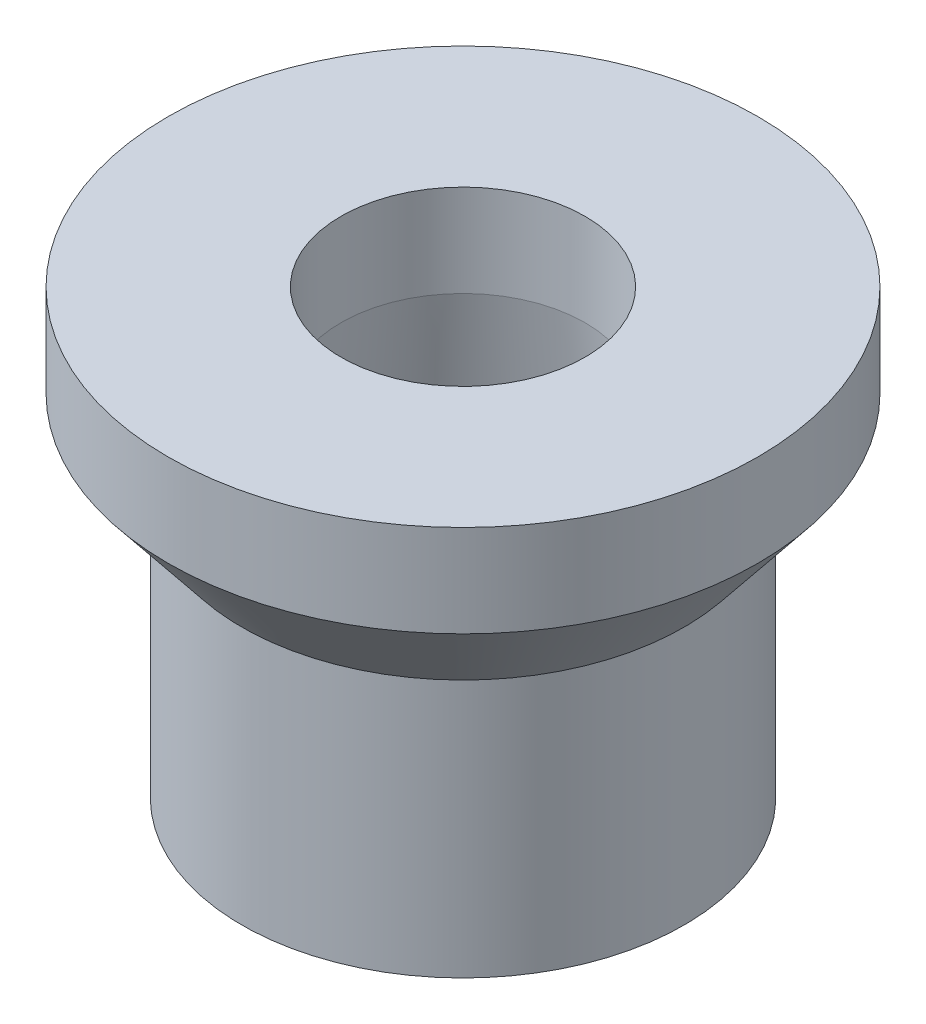
ISO-10303-21;
HEADER;
FILE_DESCRIPTION(('STEP AP214'),'2;1');
FILE_NAME('part.step','',(''),(''),'','','');
FILE_SCHEMA(('AUTOMOTIVE_DESIGN { 1 0 10303 214 1 1 1 1 }'));
ENDSEC;
DATA;
#1=APPLICATION_CONTEXT('core data for automotive mechanical design processes');
#2=APPLICATION_PROTOCOL_DEFINITION('international standard','automotive_design',2000,#1);
#3=PRODUCT_CONTEXT('',#1,'mechanical');
#4=PRODUCT('Part','Part','',(#3));
#5=PRODUCT_RELATED_PRODUCT_CATEGORY('part','',(#4));
#6=PRODUCT_DEFINITION_FORMATION('','',#4);
#7=PRODUCT_DEFINITION_CONTEXT('part definition',#1,'design');
#8=PRODUCT_DEFINITION('design','',#6,#7);
#9=PRODUCT_DEFINITION_SHAPE('','',#8);
#10=(LENGTH_UNIT() NAMED_UNIT(*) SI_UNIT(.MILLI.,.METRE.));
#11=(NAMED_UNIT(*) PLANE_ANGLE_UNIT() SI_UNIT($,.RADIAN.));
#12=(NAMED_UNIT(*) SI_UNIT($,.STERADIAN.) SOLID_ANGLE_UNIT());
#13=UNCERTAINTY_MEASURE_WITH_UNIT(LENGTH_MEASURE(1.E-05),#10,'distance_accuracy_value','');
#14=(GEOMETRIC_REPRESENTATION_CONTEXT(3) GLOBAL_UNCERTAINTY_ASSIGNED_CONTEXT((#13)) GLOBAL_UNIT_ASSIGNED_CONTEXT((#10,
#11,#12)) REPRESENTATION_CONTEXT('',''));
#15=CARTESIAN_POINT('',(0.,0.,0.));
#16=DIRECTION('',(0.,0.,1.));
#17=DIRECTION('',(1.,0.,0.));
#18=AXIS2_PLACEMENT_3D('',#15,#16,#17);
#19=CARTESIAN_POINT('',(5.99999999999998,0.,0.));
#20=DIRECTION('',(0.,-0.999999999999992,0.));
#21=DIRECTION('',(0.,0.,-1.00000000000002));
#22=AXIS2_PLACEMENT_3D('',#19,#20,#21);
#23=PLANE('',#22);
#24=CARTESIAN_POINT('',(0.,0.,0.));
#25=DIRECTION('',(0.,-0.999999999999992,0.));
#26=DIRECTION('',(0.,0.,-1.00000000000002));
#27=AXIS2_PLACEMENT_3D('',#24,#25,#26);
#28=CIRCLE('',#27,4.50000000000017);
#29=CARTESIAN_POINT('',(0.,0.,-4.50000000000024));
#30=VERTEX_POINT('',#29);
#31=EDGE_CURVE('E31',#30,#30,#28,.F.);
#32=ORIENTED_EDGE('',*,*,#31,.T.);
#33=EDGE_LOOP('',(#32));
#34=FACE_BOUND('',#33,.T.);
#35=CARTESIAN_POINT('',(0.,0.,0.));
#36=DIRECTION('',(0.,-0.999999999999992,0.));
#37=DIRECTION('',(0.,0.,-1.00000000000002));
#38=AXIS2_PLACEMENT_3D('',#35,#36,#37);
#39=CIRCLE('',#38,6.);
#40=CARTESIAN_POINT('',(0.,0.,-6.0000000000001));
#41=VERTEX_POINT('',#40);
#42=EDGE_CURVE('E17',#41,#41,#39,.F.);
#43=ORIENTED_EDGE('',*,*,#42,.F.);
#44=EDGE_LOOP('',(#43));
#45=FACE_BOUND('',#44,.T.);
#46=ADVANCED_FACE('F14',(#34,#45),#23,.T.);
#47=CARTESIAN_POINT('',(0.,0.,0.));
#48=DIRECTION('',(0.,-0.999999999999992,0.));
#49=DIRECTION('',(0.,0.,-1.00000000000002));
#50=AXIS2_PLACEMENT_3D('',#47,#48,#49);
#51=CYLINDRICAL_SURFACE('',#50,6.);
#52=CARTESIAN_POINT('',(0.,7.000000000005,0.));
#53=DIRECTION('',(0.,0.999999999999992,0.));
#54=DIRECTION('',(0.,0.,1.00000000000002));
#55=AXIS2_PLACEMENT_3D('',#52,#53,#54);
#56=CIRCLE('',#55,6.00000000002865);
#57=CARTESIAN_POINT('',(0.,7.000000000005,-6.0000000000001));
#58=VERTEX_POINT('',#57);
#59=EDGE_CURVE('E29',#58,#58,#56,.T.);
#60=CARTESIAN_POINT('',(0.,7.000000000005,-6.0000000000001));
#61=CARTESIAN_POINT('',(0.,6.92708333333828,-6.0000000000001));
#62=CARTESIAN_POINT('',(0.,6.85416666667156,-6.0000000000001));
#63=CARTESIAN_POINT('',(0.,6.70833333333813,-6.0000000000001));
#64=CARTESIAN_POINT('',(0.,6.63541666667141,-6.0000000000001));
#65=CARTESIAN_POINT('',(0.,6.48958333333797,-6.0000000000001));
#66=CARTESIAN_POINT('',(0.,6.41666666667125,-6.0000000000001));
#67=CARTESIAN_POINT('',(0.,6.27083333333781,-6.0000000000001));
#68=CARTESIAN_POINT('',(0.,6.19791666667109,-6.0000000000001));
#69=CARTESIAN_POINT('',(0.,6.05208333333766,-6.0000000000001));
#70=CARTESIAN_POINT('',(0.,5.97916666667094,-6.0000000000001));
#71=CARTESIAN_POINT('',(0.,5.8333333333375,-6.0000000000001));
#72=CARTESIAN_POINT('',(0.,5.76041666667078,-6.0000000000001));
#73=CARTESIAN_POINT('',(0.,5.61458333333734,-6.0000000000001));
#74=CARTESIAN_POINT('',(0.,5.54166666667063,-6.0000000000001));
#75=CARTESIAN_POINT('',(0.,5.39583333333719,-6.0000000000001));
#76=CARTESIAN_POINT('',(0.,5.32291666667047,-6.0000000000001));
#77=CARTESIAN_POINT('',(0.,5.17708333333703,-6.0000000000001));
#78=CARTESIAN_POINT('',(0.,5.10416666667031,-6.0000000000001));
#79=CARTESIAN_POINT('',(0.,4.95833333333688,-6.0000000000001));
#80=CARTESIAN_POINT('',(0.,4.88541666667016,-6.0000000000001));
#81=CARTESIAN_POINT('',(0.,4.73958333333672,-6.0000000000001));
#82=CARTESIAN_POINT('',(0.,4.66666666667,-6.0000000000001));
#83=CARTESIAN_POINT('',(0.,4.52083333333656,-6.0000000000001));
#84=CARTESIAN_POINT('',(0.,4.44791666666984,-6.0000000000001));
#85=CARTESIAN_POINT('',(0.,4.30208333333641,-6.0000000000001));
#86=CARTESIAN_POINT('',(0.,4.22916666666969,-6.0000000000001));
#87=CARTESIAN_POINT('',(0.,4.08333333333625,-6.0000000000001));
#88=CARTESIAN_POINT('',(0.,4.01041666666953,-6.0000000000001));
#89=CARTESIAN_POINT('',(0.,3.86458333333609,-6.0000000000001));
#90=CARTESIAN_POINT('',(0.,3.79166666666938,-6.0000000000001));
#91=CARTESIAN_POINT('',(0.,3.64583333333594,-6.0000000000001));
#92=CARTESIAN_POINT('',(0.,3.57291666666922,-6.0000000000001));
#93=CARTESIAN_POINT('',(0.,3.42708333333578,-6.0000000000001));
#94=CARTESIAN_POINT('',(0.,3.35416666666906,-6.0000000000001));
#95=CARTESIAN_POINT('',(0.,3.20833333333563,-6.0000000000001));
#96=CARTESIAN_POINT('',(0.,3.13541666666891,-6.0000000000001));
#97=CARTESIAN_POINT('',(0.,2.98958333333547,-6.0000000000001));
#98=CARTESIAN_POINT('',(0.,2.91666666666875,-6.0000000000001));
#99=CARTESIAN_POINT('',(0.,2.77083333333531,-6.0000000000001));
#100=CARTESIAN_POINT('',(0.,2.69791666666859,-6.0000000000001));
#101=CARTESIAN_POINT('',(0.,2.55208333333516,-6.0000000000001));
#102=CARTESIAN_POINT('',(0.,2.47916666666844,-6.0000000000001));
#103=CARTESIAN_POINT('',(0.,2.333333333335,-6.0000000000001));
#104=CARTESIAN_POINT('',(0.,2.26041666666828,-6.0000000000001));
#105=CARTESIAN_POINT('',(0.,2.11458333333484,-6.0000000000001));
#106=CARTESIAN_POINT('',(0.,2.04166666666813,-6.0000000000001));
#107=CARTESIAN_POINT('',(0.,1.89583333333469,-6.0000000000001));
#108=CARTESIAN_POINT('',(0.,1.82291666666797,-6.0000000000001));
#109=CARTESIAN_POINT('',(0.,1.67708333333453,-6.0000000000001));
#110=CARTESIAN_POINT('',(0.,1.60416666666781,-6.0000000000001));
#111=CARTESIAN_POINT('',(0.,1.45833333333438,-6.0000000000001));
#112=CARTESIAN_POINT('',(0.,1.38541666666766,-6.0000000000001));
#113=CARTESIAN_POINT('',(0.,1.23958333333422,-6.0000000000001));
#114=CARTESIAN_POINT('',(0.,1.1666666666675,-6.0000000000001));
#115=CARTESIAN_POINT('',(0.,1.02083333333406,-6.0000000000001));
#116=CARTESIAN_POINT('',(0.,0.947916666667344,-6.0000000000001));
#117=CARTESIAN_POINT('',(0.,0.802083333333907,-6.0000000000001));
#118=CARTESIAN_POINT('',(0.,0.729166666667188,-6.0000000000001));
#119=CARTESIAN_POINT('',(0.,0.58333333333375,-6.0000000000001));
#120=CARTESIAN_POINT('',(0.,0.510416666667032,-6.0000000000001));
#121=CARTESIAN_POINT('',(0.,0.364583333333594,-6.0000000000001));
#122=CARTESIAN_POINT('',(0.,0.291666666666875,-6.0000000000001));
#123=CARTESIAN_POINT('',(0.,0.145833333333438,-6.0000000000001));
#124=CARTESIAN_POINT('',(0.,0.0729166666667189,-6.0000000000001));
#125=CARTESIAN_POINT('',(0.,0.,-6.0000000000001));
#126=B_SPLINE_CURVE_WITH_KNOTS('',3,(#60,#61,#62,#63,#64,#65,#66,#67,#68,#69,#70,#71,#72,#73,
#74,#75,#76,#77,#78,#79,#80,#81,#82,#83,#84,#85,#86,#87,#88,#89,#90,#91,#92,#93,#94,#95,#96,#97,
#98,#99,#100,#101,#102,#103,#104,#105,#106,#107,#108,#109,#110,#111,#112,#113,#114,#115,#116,
#117,#118,#119,#120,#121,#122,#123,#124,#125),.UNSPECIFIED.,.F.,.F.,(4,2,2,2,2,2,2,2,2,2,2,2,2,
2,2,2,2,2,2,2,2,2,2,2,2,2,2,2,2,2,2,2,4),(0.,0.218750000000156,0.437500000000313,
0.656250000000469,0.875000000000625,1.09375000000078,1.31250000000094,1.53125000000109,
1.75000000000125,1.96875000000141,2.18750000000156,2.40625000000172,2.62500000000187,
2.84375000000203,3.06250000000219,3.28125000000234,3.5000000000025,3.71875000000266,
3.93750000000281,4.15625000000297,4.37500000000313,4.59375000000328,4.81250000000344,
5.0312500000036,5.25000000000375,5.46875000000391,5.68750000000406,5.90625000000422,
6.12500000000438,6.34375000000453,6.56250000000469,6.78125000000485,7.000000000005),.UNSPECIFIED.);
#127=EDGE_CURVE('BSEAM40',#58,#41,#126,.T.);
#128=ORIENTED_EDGE('',*,*,#59,.F.);
#129=ORIENTED_EDGE('',*,*,#42,.T.);
#130=ORIENTED_EDGE('',*,*,#127,.T.);
#131=ORIENTED_EDGE('',*,*,#127,.F.);
#132=EDGE_LOOP('',(#128,#130,#129,#131));
#133=FACE_BOUND('',#132,.T.);
#134=ADVANCED_FACE('F40',(#133),#51,.T.);
#135=CARTESIAN_POINT('',(0.,1.13686837721616E-10,0.));
#136=DIRECTION('',(0.,-0.999999999999992,0.));
#137=DIRECTION('',(0.,0.,-1.00000000000002));
#138=AXIS2_PLACEMENT_3D('',#135,#136,#137);
#139=CONICAL_SURFACE('',#138,4.49999999998596,0.124354994547498);
#140=CARTESIAN_POINT('',(0.,9.5,0.));
#141=DIRECTION('',(0.,-0.999999999999992,0.));
#142=DIRECTION('',(0.,0.,-1.00000000000002));
#143=AXIS2_PLACEMENT_3D('',#140,#141,#142);
#144=CIRCLE('',#143,3.3125);
#145=CARTESIAN_POINT('',(0.,9.5,-3.31249999999311));
#146=VERTEX_POINT('',#145);
#147=EDGE_CURVE('E36',#146,#146,#144,.F.);
#148=CARTESIAN_POINT('',(0.,0.,-4.50000000000024));
#149=CARTESIAN_POINT('',(0.,0.0989583333333335,-4.4876302083335));
#150=CARTESIAN_POINT('',(0.,0.197916666666667,-4.47526041666676));
#151=CARTESIAN_POINT('',(0.,0.395833333333333,-4.45052083333328));
#152=CARTESIAN_POINT('',(0.,0.494791666666667,-4.43815104166654));
#153=CARTESIAN_POINT('',(0.,0.692708333333333,-4.41341145833306));
#154=CARTESIAN_POINT('',(0.,0.791666666666667,-4.40104166666631));
#155=CARTESIAN_POINT('',(0.,0.989583333333333,-4.37630208333283));
#156=CARTESIAN_POINT('',(0.,1.08854166666667,-4.36393229166609));
#157=CARTESIAN_POINT('',(0.,1.28645833333333,-4.33919270833261));
#158=CARTESIAN_POINT('',(0.,1.38541666666667,-4.32682291666587));
#159=CARTESIAN_POINT('',(0.,1.58333333333333,-4.30208333333239));
#160=CARTESIAN_POINT('',(0.,1.68229166666667,-4.28971354166565));
#161=CARTESIAN_POINT('',(0.,1.88020833333333,-4.26497395833216));
#162=CARTESIAN_POINT('',(0.,1.97916666666667,-4.25260416666542));
#163=CARTESIAN_POINT('',(0.,2.17708333333333,-4.22786458333194));
#164=CARTESIAN_POINT('',(0.,2.27604166666667,-4.2154947916652));
#165=CARTESIAN_POINT('',(0.,2.47395833333333,-4.19075520833172));
#166=CARTESIAN_POINT('',(0.,2.57291666666667,-4.17838541666498));
#167=CARTESIAN_POINT('',(0.,2.77083333333333,-4.1536458333315));
#168=CARTESIAN_POINT('',(0.,2.86979166666667,-4.14127604166475));
#169=CARTESIAN_POINT('',(0.,3.06770833333333,-4.11653645833127));
#170=CARTESIAN_POINT('',(0.,3.16666666666667,-4.10416666666453));
#171=CARTESIAN_POINT('',(0.,3.36458333333333,-4.07942708333105));
#172=CARTESIAN_POINT('',(0.,3.46354166666667,-4.06705729166431));
#173=CARTESIAN_POINT('',(0.,3.66145833333333,-4.04231770833083));
#174=CARTESIAN_POINT('',(0.,3.76041666666667,-4.02994791666409));
#175=CARTESIAN_POINT('',(0.,3.95833333333333,-4.0052083333306));
#176=CARTESIAN_POINT('',(0.,4.05729166666667,-3.99283854166386));
#177=CARTESIAN_POINT('',(0.,4.25520833333333,-3.96809895833038));
#178=CARTESIAN_POINT('',(0.,4.35416666666667,-3.95572916666364));
#179=CARTESIAN_POINT('',(0.,4.55208333333333,-3.93098958333016));
#180=CARTESIAN_POINT('',(0.,4.65104166666667,-3.91861979166342));
#181=CARTESIAN_POINT('',(0.,4.84895833333333,-3.89388020832993));
#182=CARTESIAN_POINT('',(0.,4.94791666666667,-3.88151041666319));
#183=CARTESIAN_POINT('',(0.,5.14583333333333,-3.85677083332971));
#184=CARTESIAN_POINT('',(0.,5.24479166666667,-3.84440104166297));
#185=CARTESIAN_POINT('',(0.,5.44270833333333,-3.81966145832949));
#186=CARTESIAN_POINT('',(0.,5.54166666666667,-3.80729166666275));
#187=CARTESIAN_POINT('',(0.,5.73958333333333,-3.78255208332927));
#188=CARTESIAN_POINT('',(0.,5.83854166666667,-3.77018229166253));
#189=CARTESIAN_POINT('',(0.,6.03645833333333,-3.74544270832904));
#190=CARTESIAN_POINT('',(0.,6.13541666666667,-3.7330729166623));
#191=CARTESIAN_POINT('',(0.,6.33333333333333,-3.70833333332882));
#192=CARTESIAN_POINT('',(0.,6.43229166666667,-3.69596354166208));
#193=CARTESIAN_POINT('',(0.,6.63020833333333,-3.6712239583286));
#194=CARTESIAN_POINT('',(0.,6.72916666666667,-3.65885416666186));
#195=CARTESIAN_POINT('',(0.,6.92708333333333,-3.63411458332837));
#196=CARTESIAN_POINT('',(0.,7.02604166666667,-3.62174479166163));
#197=CARTESIAN_POINT('',(0.,7.22395833333333,-3.59700520832815));
#198=CARTESIAN_POINT('',(0.,7.32291666666667,-3.58463541666141));
#199=CARTESIAN_POINT('',(0.,7.52083333333333,-3.55989583332793));
#200=CARTESIAN_POINT('',(0.,7.61979166666667,-3.54752604166119));
#201=CARTESIAN_POINT('',(0.,7.81770833333333,-3.5227864583277));
#202=CARTESIAN_POINT('',(0.,7.91666666666667,-3.51041666666096));
#203=CARTESIAN_POINT('',(0.,8.11458333333333,-3.48567708332748));
#204=CARTESIAN_POINT('',(0.,8.21354166666667,-3.47330729166074));
#205=CARTESIAN_POINT('',(0.,8.41145833333333,-3.44856770832726));
#206=CARTESIAN_POINT('',(0.,8.51041666666667,-3.43619791666052));
#207=CARTESIAN_POINT('',(0.,8.70833333333333,-3.41145833332704));
#208=CARTESIAN_POINT('',(0.,8.80729166666667,-3.3990885416603));
#209=CARTESIAN_POINT('',(0.,9.00520833333333,-3.37434895832681));
#210=CARTESIAN_POINT('',(0.,9.10416666666667,-3.36197916666007));
#211=CARTESIAN_POINT('',(0.,9.30208333333333,-3.33723958332659));
#212=CARTESIAN_POINT('',(0.,9.40104166666667,-3.32486979165985));
#213=CARTESIAN_POINT('',(0.,9.5,-3.31249999999311));
#214=B_SPLINE_CURVE_WITH_KNOTS('',3,(#148,#149,#150,#151,#152,#153,#154,#155,#156,#157,#158,
#159,#160,#161,#162,#163,#164,#165,#166,#167,#168,#169,#170,#171,#172,#173,#174,#175,#176,#177,
#178,#179,#180,#181,#182,#183,#184,#185,#186,#187,#188,#189,#190,#191,#192,#193,#194,#195,#196,
#197,#198,#199,#200,#201,#202,#203,#204,#205,#206,#207,#208,#209,#210,#211,#212,#213),
.UNSPECIFIED.,.F.,.F.,(4,2,2,2,2,2,2,2,2,2,2,2,2,2,2,2,2,2,2,2,2,2,2,2,2,2,2,2,2,2,2,2,4),(0.,
0.299185346128294,0.598370692256588,0.897556038384882,1.19674138451318,1.49592673064147,
1.79511207676976,2.09429742289806,2.39348276902635,2.69266811515465,2.99185346128294,
3.29103880741124,3.59022415353953,3.88940949966782,4.18859484579612,4.48778019192441,
4.78696553805271,5.086150884181,5.38533623030929,5.68452157643759,5.98370692256588,
6.28289226869417,6.58207761482247,6.88126296095076,7.18044830707906,7.47963365320735,
7.77881899933564,8.07800434546394,8.37718969159223,8.67637503772053,8.97556038384882,
9.27474572997712,9.57393107610541),.UNSPECIFIED.);
#215=EDGE_CURVE('BSEAM47',#30,#146,#214,.T.);
#216=ORIENTED_EDGE('',*,*,#31,.F.);
#217=ORIENTED_EDGE('',*,*,#147,.T.);
#218=ORIENTED_EDGE('',*,*,#215,.T.);
#219=ORIENTED_EDGE('',*,*,#215,.F.);
#220=EDGE_LOOP('',(#216,#218,#217,#219));
#221=FACE_BOUND('',#220,.T.);
#222=ADVANCED_FACE('F47',(#221),#139,.F.);
#223=CARTESIAN_POINT('',(0.,9.4999999998322,0.));
#224=DIRECTION('',(0.,0.999999999999992,0.));
#225=DIRECTION('',(0.,0.,1.00000000000002));
#226=AXIS2_PLACEMENT_3D('',#223,#224,#225);
#227=CONICAL_SURFACE('',#226,7.99999999986767,0.674740942223553);
#228=ORIENTED_EDGE('',*,*,#59,.T.);
#229=EDGE_LOOP('',(#228));
#230=FACE_BOUND('',#229,.T.);
#231=CARTESIAN_POINT('',(0.,9.5,0.));
#232=DIRECTION('',(0.,-0.999999999999992,0.));
#233=DIRECTION('',(0.,0.,-1.00000000000002));
#234=AXIS2_PLACEMENT_3D('',#231,#232,#233);
#235=CIRCLE('',#234,8.);
#236=CARTESIAN_POINT('',(0.,9.5,-8.00000000000013));
#237=VERTEX_POINT('',#236);
#238=EDGE_CURVE('E26',#237,#237,#235,.F.);
#239=ORIENTED_EDGE('',*,*,#238,.F.);
#240=EDGE_LOOP('',(#239));
#241=FACE_BOUND('',#240,.T.);
#242=ADVANCED_FACE('F63',(#230,#241),#227,.T.);
#243=CARTESIAN_POINT('',(0.,12.,0.));
#244=DIRECTION('',(0.,-0.999999999999992,0.));
#245=DIRECTION('',(0.,0.,-1.00000000000002));
#246=AXIS2_PLACEMENT_3D('',#243,#244,#245);
#247=CYLINDRICAL_SURFACE('',#246,3.3125);
#248=CARTESIAN_POINT('',(0.,12.,0.));
#249=DIRECTION('',(0.,-0.999999999999992,0.));
#250=DIRECTION('',(0.,0.,-1.00000000000002));
#251=AXIS2_PLACEMENT_3D('',#248,#249,#250);
#252=CIRCLE('',#251,3.3125);
#253=CARTESIAN_POINT('',(0.,12.,-3.31250000000005));
#254=VERTEX_POINT('',#253);
#255=EDGE_CURVE('E21',#254,#254,#252,.T.);
#256=CARTESIAN_POINT('',(0.,9.5,-3.31250000000005));
#257=CARTESIAN_POINT('',(0.,9.52604166666667,-3.31250000000005));
#258=CARTESIAN_POINT('',(0.,9.55208333333333,-3.31250000000005));
#259=CARTESIAN_POINT('',(0.,9.60416666666667,-3.31250000000005));
#260=CARTESIAN_POINT('',(0.,9.63020833333333,-3.31250000000005));
#261=CARTESIAN_POINT('',(0.,9.68229166666667,-3.31250000000005));
#262=CARTESIAN_POINT('',(0.,9.70833333333333,-3.31250000000005));
#263=CARTESIAN_POINT('',(0.,9.76041666666667,-3.31250000000005));
#264=CARTESIAN_POINT('',(0.,9.78645833333333,-3.31250000000005));
#265=CARTESIAN_POINT('',(0.,9.83854166666667,-3.31250000000005));
#266=CARTESIAN_POINT('',(0.,9.86458333333333,-3.31250000000005));
#267=CARTESIAN_POINT('',(0.,9.91666666666667,-3.31250000000005));
#268=CARTESIAN_POINT('',(0.,9.94270833333333,-3.31250000000005));
#269=CARTESIAN_POINT('',(0.,9.99479166666667,-3.31250000000005));
#270=CARTESIAN_POINT('',(0.,10.0208333333333,-3.31250000000005));
#271=CARTESIAN_POINT('',(0.,10.0729166666667,-3.31250000000005));
#272=CARTESIAN_POINT('',(0.,10.0989583333333,-3.31250000000005));
#273=CARTESIAN_POINT('',(0.,10.1510416666667,-3.31250000000005));
#274=CARTESIAN_POINT('',(0.,10.1770833333333,-3.31250000000005));
#275=CARTESIAN_POINT('',(0.,10.2291666666667,-3.31250000000005));
#276=CARTESIAN_POINT('',(0.,10.2552083333333,-3.31250000000005));
#277=CARTESIAN_POINT('',(0.,10.3072916666667,-3.31250000000005));
#278=CARTESIAN_POINT('',(0.,10.3333333333333,-3.31250000000005));
#279=CARTESIAN_POINT('',(0.,10.3854166666667,-3.31250000000005));
#280=CARTESIAN_POINT('',(0.,10.4114583333333,-3.31250000000005));
#281=CARTESIAN_POINT('',(0.,10.4635416666667,-3.31250000000005));
#282=CARTESIAN_POINT('',(0.,10.4895833333333,-3.31250000000005));
#283=CARTESIAN_POINT('',(0.,10.5416666666667,-3.31250000000005));
#284=CARTESIAN_POINT('',(0.,10.5677083333333,-3.31250000000005));
#285=CARTESIAN_POINT('',(0.,10.6197916666667,-3.31250000000005));
#286=CARTESIAN_POINT('',(0.,10.6458333333333,-3.31250000000005));
#287=CARTESIAN_POINT('',(0.,10.6979166666667,-3.31250000000005));
#288=CARTESIAN_POINT('',(0.,10.7239583333333,-3.31250000000005));
#289=CARTESIAN_POINT('',(0.,10.7760416666667,-3.31250000000005));
#290=CARTESIAN_POINT('',(0.,10.8020833333333,-3.31250000000005));
#291=CARTESIAN_POINT('',(0.,10.8541666666667,-3.31250000000005));
#292=CARTESIAN_POINT('',(0.,10.8802083333333,-3.31250000000005));
#293=CARTESIAN_POINT('',(0.,10.9322916666667,-3.31250000000005));
#294=CARTESIAN_POINT('',(0.,10.9583333333333,-3.31250000000005));
#295=CARTESIAN_POINT('',(0.,11.0104166666667,-3.31250000000005));
#296=CARTESIAN_POINT('',(0.,11.0364583333333,-3.31250000000005));
#297=CARTESIAN_POINT('',(0.,11.0885416666667,-3.31250000000005));
#298=CARTESIAN_POINT('',(0.,11.1145833333333,-3.31250000000005));
#299=CARTESIAN_POINT('',(0.,11.1666666666667,-3.31250000000005));
#300=CARTESIAN_POINT('',(0.,11.1927083333333,-3.31250000000005));
#301=CARTESIAN_POINT('',(0.,11.2447916666667,-3.31250000000005));
#302=CARTESIAN_POINT('',(0.,11.2708333333333,-3.31250000000005));
#303=CARTESIAN_POINT('',(0.,11.3229166666667,-3.31250000000005));
#304=CARTESIAN_POINT('',(0.,11.3489583333333,-3.31250000000005));
#305=CARTESIAN_POINT('',(0.,11.4010416666667,-3.31250000000005));
#306=CARTESIAN_POINT('',(0.,11.4270833333333,-3.31250000000005));
#307=CARTESIAN_POINT('',(0.,11.4791666666667,-3.31250000000005));
#308=CARTESIAN_POINT('',(0.,11.5052083333333,-3.31250000000005));
#309=CARTESIAN_POINT('',(0.,11.5572916666667,-3.31250000000005));
#310=CARTESIAN_POINT('',(0.,11.5833333333333,-3.31250000000005));
#311=CARTESIAN_POINT('',(0.,11.6354166666667,-3.31250000000005));
#312=CARTESIAN_POINT('',(0.,11.6614583333333,-3.31250000000005));
#313=CARTESIAN_POINT('',(0.,11.7135416666667,-3.31250000000005));
#314=CARTESIAN_POINT('',(0.,11.7395833333333,-3.31250000000005));
#315=CARTESIAN_POINT('',(0.,11.7916666666667,-3.31250000000005));
#316=CARTESIAN_POINT('',(0.,11.8177083333333,-3.31250000000005));
#317=CARTESIAN_POINT('',(0.,11.8697916666667,-3.31250000000005));
#318=CARTESIAN_POINT('',(0.,11.8958333333333,-3.31250000000005));
#319=CARTESIAN_POINT('',(0.,11.9479166666667,-3.31250000000005));
#320=CARTESIAN_POINT('',(0.,11.9739583333333,-3.31250000000005));
#321=CARTESIAN_POINT('',(0.,12.,-3.31250000000005));
#322=B_SPLINE_CURVE_WITH_KNOTS('',3,(#256,#257,#258,#259,#260,#261,#262,#263,#264,#265,#266,
#267,#268,#269,#270,#271,#272,#273,#274,#275,#276,#277,#278,#279,#280,#281,#282,#283,#284,#285,
#286,#287,#288,#289,#290,#291,#292,#293,#294,#295,#296,#297,#298,#299,#300,#301,#302,#303,#304,
#305,#306,#307,#308,#309,#310,#311,#312,#313,#314,#315,#316,#317,#318,#319,#320,#321),
.UNSPECIFIED.,.F.,.F.,(4,2,2,2,2,2,2,2,2,2,2,2,2,2,2,2,2,2,2,2,2,2,2,2,2,2,2,2,2,2,2,2,4),(0.,
0.0781250000000001,0.15625,0.234375,0.3125,0.390625,0.468749999999999,0.546874999999999,
0.624999999999999,0.703124999999999,0.781249999999999,0.859374999999999,0.937499999999999,
1.015625,1.09375,1.171875,1.25,1.328125,1.40625,1.484375,1.5625,1.640625,1.71875,1.796875,1.875,
1.953125,2.03125,2.109375,2.1875,2.265625,2.34375,2.421875,2.5),.UNSPECIFIED.);
#323=EDGE_CURVE('BSEAM56',#146,#254,#322,.T.);
#324=ORIENTED_EDGE('',*,*,#147,.F.);
#325=ORIENTED_EDGE('',*,*,#255,.F.);
#326=ORIENTED_EDGE('',*,*,#323,.T.);
#327=ORIENTED_EDGE('',*,*,#323,.F.);
#328=EDGE_LOOP('',(#324,#326,#325,#327));
#329=FACE_BOUND('',#328,.T.);
#330=ADVANCED_FACE('F56',(#329),#247,.F.);
#331=CARTESIAN_POINT('',(0.,0.,0.));
#332=DIRECTION('',(0.,-0.999999999999992,0.));
#333=DIRECTION('',(0.,0.,-1.00000000000002));
#334=AXIS2_PLACEMENT_3D('',#331,#332,#333);
#335=CYLINDRICAL_SURFACE('',#334,8.);
#336=CARTESIAN_POINT('',(0.,12.,0.));
#337=DIRECTION('',(0.,-0.999999999999992,0.));
#338=DIRECTION('',(0.,0.,-1.00000000000002));
#339=AXIS2_PLACEMENT_3D('',#336,#337,#338);
#340=CIRCLE('',#339,8.);
#341=CARTESIAN_POINT('',(0.,12.,-8.00000000000013));
#342=VERTEX_POINT('',#341);
#343=EDGE_CURVE('E10',#342,#342,#340,.F.);
#344=CARTESIAN_POINT('',(0.,12.,-8.00000000000013));
#345=CARTESIAN_POINT('',(0.,11.9739583333333,-8.00000000000013));
#346=CARTESIAN_POINT('',(0.,11.9479166666667,-8.00000000000013));
#347=CARTESIAN_POINT('',(0.,11.8958333333333,-8.00000000000013));
#348=CARTESIAN_POINT('',(0.,11.8697916666667,-8.00000000000013));
#349=CARTESIAN_POINT('',(0.,11.8177083333333,-8.00000000000013));
#350=CARTESIAN_POINT('',(0.,11.7916666666667,-8.00000000000013));
#351=CARTESIAN_POINT('',(0.,11.7395833333333,-8.00000000000013));
#352=CARTESIAN_POINT('',(0.,11.7135416666667,-8.00000000000013));
#353=CARTESIAN_POINT('',(0.,11.6614583333333,-8.00000000000013));
#354=CARTESIAN_POINT('',(0.,11.6354166666667,-8.00000000000013));
#355=CARTESIAN_POINT('',(0.,11.5833333333333,-8.00000000000013));
#356=CARTESIAN_POINT('',(0.,11.5572916666667,-8.00000000000013));
#357=CARTESIAN_POINT('',(0.,11.5052083333333,-8.00000000000013));
#358=CARTESIAN_POINT('',(0.,11.4791666666667,-8.00000000000013));
#359=CARTESIAN_POINT('',(0.,11.4270833333333,-8.00000000000013));
#360=CARTESIAN_POINT('',(0.,11.4010416666667,-8.00000000000013));
#361=CARTESIAN_POINT('',(0.,11.3489583333333,-8.00000000000013));
#362=CARTESIAN_POINT('',(0.,11.3229166666667,-8.00000000000013));
#363=CARTESIAN_POINT('',(0.,11.2708333333333,-8.00000000000013));
#364=CARTESIAN_POINT('',(0.,11.2447916666667,-8.00000000000013));
#365=CARTESIAN_POINT('',(0.,11.1927083333333,-8.00000000000013));
#366=CARTESIAN_POINT('',(0.,11.1666666666667,-8.00000000000013));
#367=CARTESIAN_POINT('',(0.,11.1145833333333,-8.00000000000013));
#368=CARTESIAN_POINT('',(0.,11.0885416666667,-8.00000000000013));
#369=CARTESIAN_POINT('',(0.,11.0364583333333,-8.00000000000013));
#370=CARTESIAN_POINT('',(0.,11.0104166666667,-8.00000000000013));
#371=CARTESIAN_POINT('',(0.,10.9583333333333,-8.00000000000013));
#372=CARTESIAN_POINT('',(0.,10.9322916666667,-8.00000000000013));
#373=CARTESIAN_POINT('',(0.,10.8802083333333,-8.00000000000013));
#374=CARTESIAN_POINT('',(0.,10.8541666666667,-8.00000000000013));
#375=CARTESIAN_POINT('',(0.,10.8020833333333,-8.00000000000013));
#376=CARTESIAN_POINT('',(0.,10.7760416666667,-8.00000000000013));
#377=CARTESIAN_POINT('',(0.,10.7239583333333,-8.00000000000013));
#378=CARTESIAN_POINT('',(0.,10.6979166666667,-8.00000000000013));
#379=CARTESIAN_POINT('',(0.,10.6458333333333,-8.00000000000013));
#380=CARTESIAN_POINT('',(0.,10.6197916666667,-8.00000000000013));
#381=CARTESIAN_POINT('',(0.,10.5677083333333,-8.00000000000013));
#382=CARTESIAN_POINT('',(0.,10.5416666666667,-8.00000000000013));
#383=CARTESIAN_POINT('',(0.,10.4895833333333,-8.00000000000013));
#384=CARTESIAN_POINT('',(0.,10.4635416666667,-8.00000000000013));
#385=CARTESIAN_POINT('',(0.,10.4114583333333,-8.00000000000013));
#386=CARTESIAN_POINT('',(0.,10.3854166666667,-8.00000000000013));
#387=CARTESIAN_POINT('',(0.,10.3333333333333,-8.00000000000013));
#388=CARTESIAN_POINT('',(0.,10.3072916666667,-8.00000000000013));
#389=CARTESIAN_POINT('',(0.,10.2552083333333,-8.00000000000013));
#390=CARTESIAN_POINT('',(0.,10.2291666666667,-8.00000000000013));
#391=CARTESIAN_POINT('',(0.,10.1770833333333,-8.00000000000013));
#392=CARTESIAN_POINT('',(0.,10.1510416666667,-8.00000000000013));
#393=CARTESIAN_POINT('',(0.,10.0989583333333,-8.00000000000013));
#394=CARTESIAN_POINT('',(0.,10.0729166666667,-8.00000000000013));
#395=CARTESIAN_POINT('',(0.,10.0208333333333,-8.00000000000013));
#396=CARTESIAN_POINT('',(0.,9.99479166666667,-8.00000000000013));
#397=CARTESIAN_POINT('',(0.,9.94270833333333,-8.00000000000013));
#398=CARTESIAN_POINT('',(0.,9.91666666666667,-8.00000000000013));
#399=CARTESIAN_POINT('',(0.,9.86458333333333,-8.00000000000013));
#400=CARTESIAN_POINT('',(0.,9.83854166666667,-8.00000000000013));
#401=CARTESIAN_POINT('',(0.,9.78645833333333,-8.00000000000013));
#402=CARTESIAN_POINT('',(0.,9.76041666666667,-8.00000000000013));
#403=CARTESIAN_POINT('',(0.,9.70833333333333,-8.00000000000013));
#404=CARTESIAN_POINT('',(0.,9.68229166666667,-8.00000000000013));
#405=CARTESIAN_POINT('',(0.,9.63020833333333,-8.00000000000013));
#406=CARTESIAN_POINT('',(0.,9.60416666666667,-8.00000000000013));
#407=CARTESIAN_POINT('',(0.,9.55208333333333,-8.00000000000013));
#408=CARTESIAN_POINT('',(0.,9.52604166666667,-8.00000000000013));
#409=CARTESIAN_POINT('',(0.,9.5,-8.00000000000013));
#410=B_SPLINE_CURVE_WITH_KNOTS('',3,(#344,#345,#346,#347,#348,#349,#350,#351,#352,#353,#354,
#355,#356,#357,#358,#359,#360,#361,#362,#363,#364,#365,#366,#367,#368,#369,#370,#371,#372,#373,
#374,#375,#376,#377,#378,#379,#380,#381,#382,#383,#384,#385,#386,#387,#388,#389,#390,#391,#392,
#393,#394,#395,#396,#397,#398,#399,#400,#401,#402,#403,#404,#405,#406,#407,#408,#409),
.UNSPECIFIED.,.F.,.F.,(4,2,2,2,2,2,2,2,2,2,2,2,2,2,2,2,2,2,2,2,2,2,2,2,2,2,2,2,2,2,2,2,4),(0.,
0.0781249999999983,0.156249999999998,0.234375,0.312499999999999,0.390624999999999,0.46875,
0.546874999999999,0.624999999999999,0.703124999999999,0.781249999999997,0.859374999999999,
0.937499999999999,1.015625,1.09375,1.171875,1.25,1.328125,1.40625,1.484375,1.5625,1.640625,
1.71875,1.796875,1.875,1.953125,2.03125,2.109375,2.1875,2.265625,2.34375,2.421875,2.5),.UNSPECIFIED.);
#411=EDGE_CURVE('BSEAM51',#342,#237,#410,.T.);
#412=ORIENTED_EDGE('',*,*,#343,.F.);
#413=ORIENTED_EDGE('',*,*,#238,.T.);
#414=ORIENTED_EDGE('',*,*,#411,.T.);
#415=ORIENTED_EDGE('',*,*,#411,.F.);
#416=EDGE_LOOP('',(#412,#414,#413,#415));
#417=FACE_BOUND('',#416,.T.);
#418=ADVANCED_FACE('F51',(#417),#335,.T.);
#419=CARTESIAN_POINT('',(0.,12.,0.));
#420=DIRECTION('',(0.,0.999999999999992,0.));
#421=DIRECTION('',(0.,0.,1.00000000000002));
#422=AXIS2_PLACEMENT_3D('',#419,#420,#421);
#423=PLANE('',#422);
#424=ORIENTED_EDGE('',*,*,#343,.T.);
#425=EDGE_LOOP('',(#424));
#426=FACE_BOUND('',#425,.T.);
#427=ORIENTED_EDGE('',*,*,#255,.T.);
#428=EDGE_LOOP('',(#427));
#429=FACE_BOUND('',#428,.T.);
#430=ADVANCED_FACE('F49',(#426,#429),#423,.T.);
#431=CLOSED_SHELL('',(#46,#134,#222,#242,#330,#418,#430));
#432=MANIFOLD_SOLID_BREP('B1',#431);
#433=ADVANCED_BREP_SHAPE_REPRESENTATION('',(#18,#432),#14);
#434=SHAPE_DEFINITION_REPRESENTATION(#9,#433);
ENDSEC;
END-ISO-10303-21;
